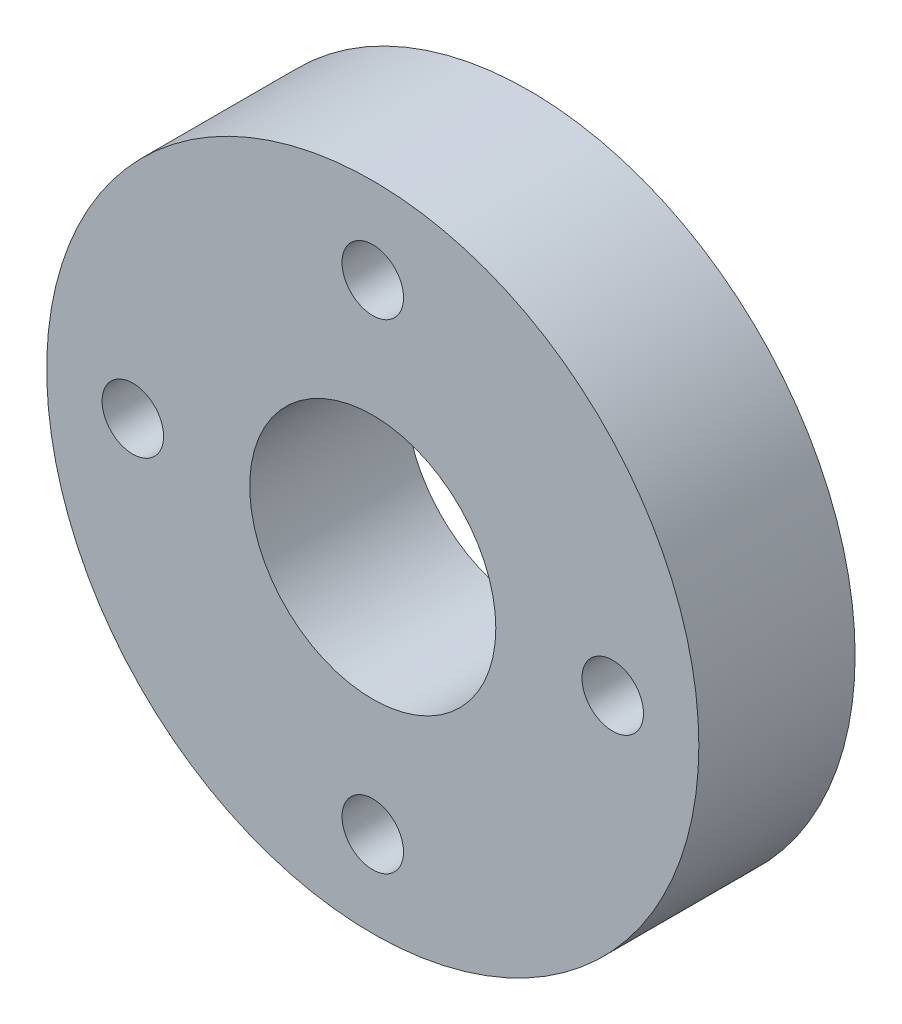
ISO-10303-21;
HEADER;
FILE_DESCRIPTION(('STEP AP214'),'2;1');
FILE_NAME('part.step','',(''),(''),'','','');
FILE_SCHEMA(('AUTOMOTIVE_DESIGN { 1 0 10303 214 1 1 1 1 }'));
ENDSEC;
DATA;
#1=APPLICATION_CONTEXT('core data for automotive mechanical design processes');
#2=APPLICATION_PROTOCOL_DEFINITION('international standard','automotive_design',2000,#1);
#3=PRODUCT_CONTEXT('',#1,'mechanical');
#4=PRODUCT('Part','Part','',(#3));
#5=PRODUCT_RELATED_PRODUCT_CATEGORY('part','',(#4));
#6=PRODUCT_DEFINITION_FORMATION('','',#4);
#7=PRODUCT_DEFINITION_CONTEXT('part definition',#1,'design');
#8=PRODUCT_DEFINITION('design','',#6,#7);
#9=PRODUCT_DEFINITION_SHAPE('','',#8);
#10=(LENGTH_UNIT() NAMED_UNIT(*) SI_UNIT(.MILLI.,.METRE.));
#11=(NAMED_UNIT(*) PLANE_ANGLE_UNIT() SI_UNIT($,.RADIAN.));
#12=(NAMED_UNIT(*) SI_UNIT($,.STERADIAN.) SOLID_ANGLE_UNIT());
#13=UNCERTAINTY_MEASURE_WITH_UNIT(LENGTH_MEASURE(1.E-05),#10,'distance_accuracy_value','');
#14=(GEOMETRIC_REPRESENTATION_CONTEXT(3) GLOBAL_UNCERTAINTY_ASSIGNED_CONTEXT((#13)) GLOBAL_UNIT_ASSIGNED_CONTEXT((#10,
#11,#12)) REPRESENTATION_CONTEXT('',''));
#15=CARTESIAN_POINT('',(0.,0.,0.));
#16=DIRECTION('',(0.,0.,1.));
#17=DIRECTION('',(1.,0.,0.));
#18=AXIS2_PLACEMENT_3D('',#15,#16,#17);
#19=CARTESIAN_POINT('',(0.,0.,6.35));
#20=DIRECTION('',(0.,0.,-1.));
#21=DIRECTION('',(-1.,0.,0.));
#22=AXIS2_PLACEMENT_3D('',#19,#20,#21);
#23=CYLINDRICAL_SURFACE('',#22,13.25);
#24=CARTESIAN_POINT('',(0.,0.,6.35));
#25=DIRECTION('',(0.,0.,1.));
#26=DIRECTION('',(1.,0.,0.));
#27=AXIS2_PLACEMENT_3D('',#24,#25,#26);
#28=CIRCLE('',#27,13.25);
#29=CARTESIAN_POINT('',(13.25,0.,6.35));
#30=VERTEX_POINT('',#29);
#31=EDGE_CURVE('E10',#30,#30,#28,.T.);
#32=ORIENTED_EDGE('',*,*,#31,.F.);
#33=EDGE_LOOP('',(#32));
#34=FACE_BOUND('',#33,.T.);
#35=CARTESIAN_POINT('',(0.,0.,0.));
#36=DIRECTION('',(0.,0.,1.));
#37=DIRECTION('',(1.,0.,0.));
#38=AXIS2_PLACEMENT_3D('',#35,#36,#37);
#39=CIRCLE('',#38,13.25);
#40=CARTESIAN_POINT('',(13.25,0.,0.));
#41=VERTEX_POINT('',#40);
#42=EDGE_CURVE('E42',#41,#41,#39,.T.);
#43=ORIENTED_EDGE('',*,*,#42,.T.);
#44=EDGE_LOOP('',(#43));
#45=FACE_BOUND('',#44,.T.);
#46=ADVANCED_FACE('F39',(#34,#45),#23,.T.);
#47=CARTESIAN_POINT('',(0.,0.,6.35));
#48=DIRECTION('',(0.,0.,1.));
#49=DIRECTION('',(1.,0.,0.));
#50=AXIS2_PLACEMENT_3D('',#47,#48,#49);
#51=PLANE('',#50);
#52=CARTESIAN_POINT('',(0.,9.75,6.35));
#53=DIRECTION('',(0.,0.,1.));
#54=DIRECTION('',(1.,0.,0.));
#55=AXIS2_PLACEMENT_3D('',#52,#53,#54);
#56=CIRCLE('',#55,1.25);
#57=CARTESIAN_POINT('',(1.25,9.75,6.35));
#58=VERTEX_POINT('',#57);
#59=EDGE_CURVE('E54',#58,#58,#56,.T.);
#60=ORIENTED_EDGE('',*,*,#59,.F.);
#61=EDGE_LOOP('',(#60));
#62=FACE_BOUND('',#61,.T.);
#63=CARTESIAN_POINT('',(9.75,0.,6.35));
#64=DIRECTION('',(0.,0.,1.));
#65=DIRECTION('',(1.,0.,0.));
#66=AXIS2_PLACEMENT_3D('',#63,#64,#65);
#67=CIRCLE('',#66,1.25000000000003);
#68=CARTESIAN_POINT('',(11.,0.,6.35));
#69=VERTEX_POINT('',#68);
#70=EDGE_CURVE('E60',#69,#69,#67,.T.);
#71=ORIENTED_EDGE('',*,*,#70,.F.);
#72=EDGE_LOOP('',(#71));
#73=FACE_BOUND('',#72,.T.);
#74=CARTESIAN_POINT('',(0.,-9.75,6.35));
#75=DIRECTION('',(0.,0.,1.));
#76=DIRECTION('',(1.,0.,0.));
#77=AXIS2_PLACEMENT_3D('',#74,#75,#76);
#78=CIRCLE('',#77,1.25000000000007);
#79=CARTESIAN_POINT('',(1.25000000000007,-9.75,6.35));
#80=VERTEX_POINT('',#79);
#81=EDGE_CURVE('E61',#80,#80,#78,.T.);
#82=ORIENTED_EDGE('',*,*,#81,.F.);
#83=EDGE_LOOP('',(#82));
#84=FACE_BOUND('',#83,.T.);
#85=CARTESIAN_POINT('',(-9.75,0.,6.35));
#86=DIRECTION('',(0.,0.,1.));
#87=DIRECTION('',(1.,0.,0.));
#88=AXIS2_PLACEMENT_3D('',#85,#86,#87);
#89=CIRCLE('',#88,1.2500000000001);
#90=CARTESIAN_POINT('',(-8.4999999999999,0.,6.35));
#91=VERTEX_POINT('',#90);
#92=EDGE_CURVE('E72',#91,#91,#89,.T.);
#93=ORIENTED_EDGE('',*,*,#92,.F.);
#94=EDGE_LOOP('',(#93));
#95=FACE_BOUND('',#94,.T.);
#96=CARTESIAN_POINT('',(0.,0.,6.35));
#97=DIRECTION('',(0.,0.,1.));
#98=DIRECTION('',(1.,0.,0.));
#99=AXIS2_PLACEMENT_3D('',#96,#97,#98);
#100=CIRCLE('',#99,5.);
#101=CARTESIAN_POINT('',(5.,0.,6.35));
#102=VERTEX_POINT('',#101);
#103=EDGE_CURVE('E51',#102,#102,#100,.T.);
#104=ORIENTED_EDGE('',*,*,#103,.F.);
#105=EDGE_LOOP('',(#104));
#106=FACE_BOUND('',#105,.T.);
#107=ORIENTED_EDGE('',*,*,#31,.T.);
#108=EDGE_LOOP('',(#107));
#109=FACE_BOUND('',#108,.T.);
#110=ADVANCED_FACE('F83',(#62,#73,#84,#95,#106,#109),#51,.T.);
#111=CARTESIAN_POINT('',(0.,0.,0.));
#112=DIRECTION('',(0.,0.,1.));
#113=DIRECTION('',(1.,0.,0.));
#114=AXIS2_PLACEMENT_3D('',#111,#112,#113);
#115=PLANE('',#114);
#116=CARTESIAN_POINT('',(0.,9.75,0.));
#117=DIRECTION('',(0.,0.,1.));
#118=DIRECTION('',(1.,0.,0.));
#119=AXIS2_PLACEMENT_3D('',#116,#117,#118);
#120=CIRCLE('',#119,1.25);
#121=CARTESIAN_POINT('',(1.25,9.75,0.));
#122=VERTEX_POINT('',#121);
#123=EDGE_CURVE('E64',#122,#122,#120,.T.);
#124=ORIENTED_EDGE('',*,*,#123,.T.);
#125=EDGE_LOOP('',(#124));
#126=FACE_BOUND('',#125,.T.);
#127=CARTESIAN_POINT('',(9.75,0.,0.));
#128=DIRECTION('',(0.,0.,1.));
#129=DIRECTION('',(1.,0.,0.));
#130=AXIS2_PLACEMENT_3D('',#127,#128,#129);
#131=CIRCLE('',#130,1.25000000000003);
#132=CARTESIAN_POINT('',(11.,0.,0.));
#133=VERTEX_POINT('',#132);
#134=EDGE_CURVE('E57',#133,#133,#131,.T.);
#135=ORIENTED_EDGE('',*,*,#134,.T.);
#136=EDGE_LOOP('',(#135));
#137=FACE_BOUND('',#136,.T.);
#138=CARTESIAN_POINT('',(0.,-9.75,0.));
#139=DIRECTION('',(0.,0.,1.));
#140=DIRECTION('',(1.,0.,0.));
#141=AXIS2_PLACEMENT_3D('',#138,#139,#140);
#142=CIRCLE('',#141,1.25000000000007);
#143=CARTESIAN_POINT('',(1.25000000000007,-9.75,0.));
#144=VERTEX_POINT('',#143);
#145=EDGE_CURVE('E75',#144,#144,#142,.T.);
#146=ORIENTED_EDGE('',*,*,#145,.T.);
#147=EDGE_LOOP('',(#146));
#148=FACE_BOUND('',#147,.T.);
#149=CARTESIAN_POINT('',(-9.75,0.,0.));
#150=DIRECTION('',(0.,0.,1.));
#151=DIRECTION('',(1.,0.,0.));
#152=AXIS2_PLACEMENT_3D('',#149,#150,#151);
#153=CIRCLE('',#152,1.2500000000001);
#154=CARTESIAN_POINT('',(-8.4999999999999,0.,0.));
#155=VERTEX_POINT('',#154);
#156=EDGE_CURVE('E69',#155,#155,#153,.T.);
#157=ORIENTED_EDGE('',*,*,#156,.T.);
#158=EDGE_LOOP('',(#157));
#159=FACE_BOUND('',#158,.T.);
#160=CARTESIAN_POINT('',(0.,0.,0.));
#161=DIRECTION('',(0.,0.,1.));
#162=DIRECTION('',(1.,0.,0.));
#163=AXIS2_PLACEMENT_3D('',#160,#161,#162);
#164=CIRCLE('',#163,5.);
#165=CARTESIAN_POINT('',(5.,0.,0.));
#166=VERTEX_POINT('',#165);
#167=EDGE_CURVE('E49',#166,#166,#164,.T.);
#168=ORIENTED_EDGE('',*,*,#167,.T.);
#169=EDGE_LOOP('',(#168));
#170=FACE_BOUND('',#169,.T.);
#171=ORIENTED_EDGE('',*,*,#42,.F.);
#172=EDGE_LOOP('',(#171));
#173=FACE_BOUND('',#172,.T.);
#174=ADVANCED_FACE('F86',(#126,#137,#148,#159,#170,#173),#115,.F.);
#175=CARTESIAN_POINT('',(0.,0.,0.));
#176=DIRECTION('',(0.,0.,1.));
#177=DIRECTION('',(1.,0.,0.));
#178=AXIS2_PLACEMENT_3D('',#175,#176,#177);
#179=CYLINDRICAL_SURFACE('',#178,5.);
#180=ORIENTED_EDGE('',*,*,#167,.F.);
#181=EDGE_LOOP('',(#180));
#182=FACE_BOUND('',#181,.T.);
#183=ORIENTED_EDGE('',*,*,#103,.T.);
#184=EDGE_LOOP('',(#183));
#185=FACE_BOUND('',#184,.T.);
#186=ADVANCED_FACE('F93',(#182,#185),#179,.F.);
#187=CARTESIAN_POINT('',(-9.75,0.,0.));
#188=DIRECTION('',(0.,0.,1.));
#189=DIRECTION('',(1.,0.,0.));
#190=AXIS2_PLACEMENT_3D('',#187,#188,#189);
#191=CYLINDRICAL_SURFACE('',#190,1.2500000000001);
#192=ORIENTED_EDGE('',*,*,#156,.F.);
#193=EDGE_LOOP('',(#192));
#194=FACE_BOUND('',#193,.T.);
#195=ORIENTED_EDGE('',*,*,#92,.T.);
#196=EDGE_LOOP('',(#195));
#197=FACE_BOUND('',#196,.T.);
#198=ADVANCED_FACE('F95',(#194,#197),#191,.F.);
#199=CARTESIAN_POINT('',(0.,-9.75,0.));
#200=DIRECTION('',(0.,0.,1.));
#201=DIRECTION('',(1.,0.,0.));
#202=AXIS2_PLACEMENT_3D('',#199,#200,#201);
#203=CYLINDRICAL_SURFACE('',#202,1.25000000000007);
#204=ORIENTED_EDGE('',*,*,#145,.F.);
#205=EDGE_LOOP('',(#204));
#206=FACE_BOUND('',#205,.T.);
#207=ORIENTED_EDGE('',*,*,#81,.T.);
#208=EDGE_LOOP('',(#207));
#209=FACE_BOUND('',#208,.T.);
#210=ADVANCED_FACE('F81',(#206,#209),#203,.F.);
#211=CARTESIAN_POINT('',(9.75,0.,0.));
#212=DIRECTION('',(0.,0.,1.));
#213=DIRECTION('',(1.,0.,0.));
#214=AXIS2_PLACEMENT_3D('',#211,#212,#213);
#215=CYLINDRICAL_SURFACE('',#214,1.25000000000003);
#216=ORIENTED_EDGE('',*,*,#134,.F.);
#217=EDGE_LOOP('',(#216));
#218=FACE_BOUND('',#217,.T.);
#219=ORIENTED_EDGE('',*,*,#70,.T.);
#220=EDGE_LOOP('',(#219));
#221=FACE_BOUND('',#220,.T.);
#222=ADVANCED_FACE('F144',(#218,#221),#215,.F.);
#223=CARTESIAN_POINT('',(0.,9.75,0.));
#224=DIRECTION('',(0.,0.,1.));
#225=DIRECTION('',(1.,0.,0.));
#226=AXIS2_PLACEMENT_3D('',#223,#224,#225);
#227=CYLINDRICAL_SURFACE('',#226,1.25);
#228=ORIENTED_EDGE('',*,*,#123,.F.);
#229=EDGE_LOOP('',(#228));
#230=FACE_BOUND('',#229,.T.);
#231=ORIENTED_EDGE('',*,*,#59,.T.);
#232=EDGE_LOOP('',(#231));
#233=FACE_BOUND('',#232,.T.);
#234=ADVANCED_FACE('F154',(#230,#233),#227,.F.);
#235=CLOSED_SHELL('',(#46,#110,#174,#186,#198,#210,#222,#234));
#236=MANIFOLD_SOLID_BREP('B2',#235);
#237=ADVANCED_BREP_SHAPE_REPRESENTATION('',(#18,#236),#14);
#238=SHAPE_DEFINITION_REPRESENTATION(#9,#237);
ENDSEC;
END-ISO-10303-21;
